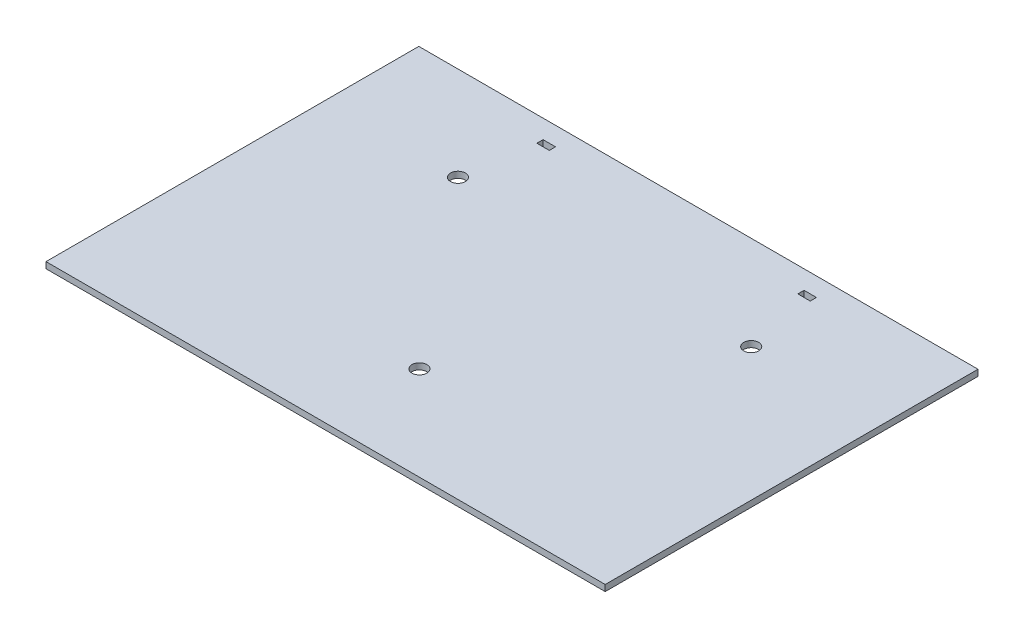
ISO-10303-21;
HEADER;
FILE_DESCRIPTION(('STEP AP214'),'2;1');
FILE_NAME('part.step','',(''),(''),'','','');
FILE_SCHEMA(('AUTOMOTIVE_DESIGN { 1 0 10303 214 1 1 1 1 }'));
ENDSEC;
DATA;
#1=APPLICATION_CONTEXT('core data for automotive mechanical design processes');
#2=APPLICATION_PROTOCOL_DEFINITION('international standard','automotive_design',2000,#1);
#3=PRODUCT_CONTEXT('',#1,'mechanical');
#4=PRODUCT('Part','Part','',(#3));
#5=PRODUCT_RELATED_PRODUCT_CATEGORY('part','',(#4));
#6=PRODUCT_DEFINITION_FORMATION('','',#4);
#7=PRODUCT_DEFINITION_CONTEXT('part definition',#1,'design');
#8=PRODUCT_DEFINITION('design','',#6,#7);
#9=PRODUCT_DEFINITION_SHAPE('','',#8);
#10=(LENGTH_UNIT() NAMED_UNIT(*) SI_UNIT(.MILLI.,.METRE.));
#11=(NAMED_UNIT(*) PLANE_ANGLE_UNIT() SI_UNIT($,.RADIAN.));
#12=(NAMED_UNIT(*) SI_UNIT($,.STERADIAN.) SOLID_ANGLE_UNIT());
#13=UNCERTAINTY_MEASURE_WITH_UNIT(LENGTH_MEASURE(1.E-05),#10,'distance_accuracy_value','');
#14=(GEOMETRIC_REPRESENTATION_CONTEXT(3) GLOBAL_UNCERTAINTY_ASSIGNED_CONTEXT((#13)) GLOBAL_UNIT_ASSIGNED_CONTEXT((#10,
#11,#12)) REPRESENTATION_CONTEXT('',''));
#15=CARTESIAN_POINT('',(0.,0.,0.));
#16=DIRECTION('',(0.,0.,1.));
#17=DIRECTION('',(1.,0.,0.));
#18=AXIS2_PLACEMENT_3D('',#15,#16,#17);
#19=CARTESIAN_POINT('',(225.,-5.,150.));
#20=DIRECTION('',(1.,0.,0.));
#21=DIRECTION('',(0.,0.,-1.));
#22=AXIS2_PLACEMENT_3D('',#19,#20,#21);
#23=PLANE('',#22);
#24=DIRECTION('',(0.,0.,-1.));
#25=VECTOR('',#24,1.);
#26=CARTESIAN_POINT('',(225.,0.,150.));
#27=LINE('',#26,#25);
#28=CARTESIAN_POINT('',(225.,0.,150.));
#29=VERTEX_POINT('',#28);
#30=CARTESIAN_POINT('',(225.,0.,-150.));
#31=VERTEX_POINT('',#30);
#32=EDGE_CURVE('E202',#29,#31,#27,.T.);
#33=ORIENTED_EDGE('',*,*,#32,.F.);
#34=DIRECTION('',(0.,1.,0.));
#35=VECTOR('',#34,1.);
#36=CARTESIAN_POINT('',(225.,-5.,150.));
#37=LINE('',#36,#35);
#38=CARTESIAN_POINT('',(225.,-5.,150.));
#39=VERTEX_POINT('',#38);
#40=EDGE_CURVE('E11',#39,#29,#37,.T.);
#41=ORIENTED_EDGE('',*,*,#40,.F.);
#42=DIRECTION('',(0.,0.,-1.));
#43=VECTOR('',#42,1.);
#44=CARTESIAN_POINT('',(225.,-5.,150.));
#45=LINE('',#44,#43);
#46=CARTESIAN_POINT('',(225.,-5.,-150.));
#47=VERTEX_POINT('',#46);
#48=EDGE_CURVE('E205',#39,#47,#45,.T.);
#49=ORIENTED_EDGE('',*,*,#48,.T.);
#50=DIRECTION('',(0.,1.,0.));
#51=VECTOR('',#50,1.);
#52=CARTESIAN_POINT('',(225.,-5.,-150.));
#53=LINE('',#52,#51);
#54=EDGE_CURVE('E34',#47,#31,#53,.T.);
#55=ORIENTED_EDGE('',*,*,#54,.T.);
#56=EDGE_LOOP('',(#33,#41,#49,#55));
#57=FACE_BOUND('',#56,.T.);
#58=ADVANCED_FACE('F31',(#57),#23,.T.);
#59=CARTESIAN_POINT('',(-225.,-5.,150.));
#60=DIRECTION('',(0.,0.,1.));
#61=DIRECTION('',(1.,0.,0.));
#62=AXIS2_PLACEMENT_3D('',#59,#60,#61);
#63=PLANE('',#62);
#64=DIRECTION('',(1.,0.,0.));
#65=VECTOR('',#64,1.);
#66=CARTESIAN_POINT('',(-225.,0.,150.));
#67=LINE('',#66,#65);
#68=CARTESIAN_POINT('',(-225.,0.,150.));
#69=VERTEX_POINT('',#68);
#70=EDGE_CURVE('E209',#69,#29,#67,.T.);
#71=ORIENTED_EDGE('',*,*,#70,.F.);
#72=DIRECTION('',(0.,1.,0.));
#73=VECTOR('',#72,1.);
#74=CARTESIAN_POINT('',(-225.,-5.,150.));
#75=LINE('',#74,#73);
#76=CARTESIAN_POINT('',(-225.,-5.,150.));
#77=VERTEX_POINT('',#76);
#78=EDGE_CURVE('E39',#77,#69,#75,.T.);
#79=ORIENTED_EDGE('',*,*,#78,.F.);
#80=DIRECTION('',(1.,0.,0.));
#81=VECTOR('',#80,1.);
#82=CARTESIAN_POINT('',(-225.,-5.,150.));
#83=LINE('',#82,#81);
#84=EDGE_CURVE('E215',#77,#39,#83,.T.);
#85=ORIENTED_EDGE('',*,*,#84,.T.);
#86=ORIENTED_EDGE('',*,*,#40,.T.);
#87=EDGE_LOOP('',(#71,#79,#85,#86));
#88=FACE_BOUND('',#87,.T.);
#89=ADVANCED_FACE('F241',(#88),#63,.T.);
#90=CARTESIAN_POINT('',(-225.,-5.,150.));
#91=DIRECTION('',(-1.,0.,0.));
#92=DIRECTION('',(0.,0.,1.));
#93=AXIS2_PLACEMENT_3D('',#90,#91,#92);
#94=PLANE('',#93);
#95=DIRECTION('',(0.,0.,1.));
#96=VECTOR('',#95,1.);
#97=CARTESIAN_POINT('',(-225.,0.,150.));
#98=LINE('',#97,#96);
#99=CARTESIAN_POINT('',(-225.,0.,-150.));
#100=VERTEX_POINT('',#99);
#101=EDGE_CURVE('E223',#100,#69,#98,.T.);
#102=ORIENTED_EDGE('',*,*,#101,.F.);
#103=DIRECTION('',(0.,1.,0.));
#104=VECTOR('',#103,1.);
#105=CARTESIAN_POINT('',(-225.,-5.,-150.));
#106=LINE('',#105,#104);
#107=CARTESIAN_POINT('',(-225.,-5.,-150.));
#108=VERTEX_POINT('',#107);
#109=EDGE_CURVE('E228',#108,#100,#106,.T.);
#110=ORIENTED_EDGE('',*,*,#109,.F.);
#111=DIRECTION('',(0.,0.,1.));
#112=VECTOR('',#111,1.);
#113=CARTESIAN_POINT('',(-225.,-5.,150.));
#114=LINE('',#113,#112);
#115=EDGE_CURVE('E212',#108,#77,#114,.T.);
#116=ORIENTED_EDGE('',*,*,#115,.T.);
#117=ORIENTED_EDGE('',*,*,#78,.T.);
#118=EDGE_LOOP('',(#102,#110,#116,#117));
#119=FACE_BOUND('',#118,.T.);
#120=ADVANCED_FACE('F246',(#119),#94,.T.);
#121=CARTESIAN_POINT('',(-225.,-5.,-150.));
#122=DIRECTION('',(0.,0.,-1.));
#123=DIRECTION('',(-1.,0.,0.));
#124=AXIS2_PLACEMENT_3D('',#121,#122,#123);
#125=PLANE('',#124);
#126=DIRECTION('',(-1.,0.,0.));
#127=VECTOR('',#126,1.);
#128=CARTESIAN_POINT('',(-225.,0.,-150.));
#129=LINE('',#128,#127);
#130=EDGE_CURVE('E220',#31,#100,#129,.T.);
#131=ORIENTED_EDGE('',*,*,#130,.F.);
#132=ORIENTED_EDGE('',*,*,#54,.F.);
#133=DIRECTION('',(-1.,0.,0.));
#134=VECTOR('',#133,1.);
#135=CARTESIAN_POINT('',(-225.,-5.,-150.));
#136=LINE('',#135,#134);
#137=EDGE_CURVE('E208',#47,#108,#136,.T.);
#138=ORIENTED_EDGE('',*,*,#137,.T.);
#139=ORIENTED_EDGE('',*,*,#109,.T.);
#140=EDGE_LOOP('',(#131,#132,#138,#139));
#141=FACE_BOUND('',#140,.T.);
#142=ADVANCED_FACE('F236',(#141),#125,.T.);
#143=CARTESIAN_POINT('',(225.,-5.,-150.));
#144=DIRECTION('',(0.,-1.,0.));
#145=DIRECTION('',(0.,0.,-1.));
#146=AXIS2_PLACEMENT_3D('',#143,#144,#145);
#147=PLANE('',#146);
#148=DIRECTION('',(0.,0.,1.));
#149=VECTOR('',#148,1.);
#150=CARTESIAN_POINT('',(100.,-5.,-135.));
#151=LINE('',#150,#149);
#152=CARTESIAN_POINT('',(100.,-5.,-135.));
#153=VERTEX_POINT('',#152);
#154=CARTESIAN_POINT('',(100.,-5.,-130.));
#155=VERTEX_POINT('',#154);
#156=EDGE_CURVE('E130',#153,#155,#151,.T.);
#157=ORIENTED_EDGE('',*,*,#156,.T.);
#158=DIRECTION('',(1.,0.,0.));
#159=VECTOR('',#158,1.);
#160=CARTESIAN_POINT('',(100.,-5.,-130.));
#161=LINE('',#160,#159);
#162=CARTESIAN_POINT('',(110.,-5.,-130.));
#163=VERTEX_POINT('',#162);
#164=EDGE_CURVE('E119',#155,#163,#161,.T.);
#165=ORIENTED_EDGE('',*,*,#164,.T.);
#166=DIRECTION('',(0.,0.,-1.));
#167=VECTOR('',#166,1.);
#168=CARTESIAN_POINT('',(110.,-5.,-135.));
#169=LINE('',#168,#167);
#170=CARTESIAN_POINT('',(110.,-5.,-135.));
#171=VERTEX_POINT('',#170);
#172=EDGE_CURVE('E141',#163,#171,#169,.T.);
#173=ORIENTED_EDGE('',*,*,#172,.T.);
#174=DIRECTION('',(-1.,0.,0.));
#175=VECTOR('',#174,1.);
#176=CARTESIAN_POINT('',(100.,-5.,-135.));
#177=LINE('',#176,#175);
#178=EDGE_CURVE('E137',#171,#153,#177,.T.);
#179=ORIENTED_EDGE('',*,*,#178,.T.);
#180=EDGE_LOOP('',(#157,#165,#173,#179));
#181=FACE_BOUND('',#180,.T.);
#182=DIRECTION('',(0.,0.,1.));
#183=VECTOR('',#182,1.);
#184=CARTESIAN_POINT('',(-110.,-5.,-135.));
#185=LINE('',#184,#183);
#186=CARTESIAN_POINT('',(-110.,-5.,-135.));
#187=VERTEX_POINT('',#186);
#188=CARTESIAN_POINT('',(-110.,-5.,-130.));
#189=VERTEX_POINT('',#188);
#190=EDGE_CURVE('E160',#187,#189,#185,.T.);
#191=ORIENTED_EDGE('',*,*,#190,.T.);
#192=DIRECTION('',(1.,0.,0.));
#193=VECTOR('',#192,1.);
#194=CARTESIAN_POINT('',(-110.,-5.,-130.));
#195=LINE('',#194,#193);
#196=CARTESIAN_POINT('',(-100.,-5.,-130.));
#197=VERTEX_POINT('',#196);
#198=EDGE_CURVE('E177',#189,#197,#195,.T.);
#199=ORIENTED_EDGE('',*,*,#198,.T.);
#200=DIRECTION('',(0.,0.,-1.));
#201=VECTOR('',#200,1.);
#202=CARTESIAN_POINT('',(-100.,-5.,-135.));
#203=LINE('',#202,#201);
#204=CARTESIAN_POINT('',(-100.,-5.,-135.));
#205=VERTEX_POINT('',#204);
#206=EDGE_CURVE('E126',#197,#205,#203,.T.);
#207=ORIENTED_EDGE('',*,*,#206,.T.);
#208=DIRECTION('',(-1.,0.,0.));
#209=VECTOR('',#208,1.);
#210=CARTESIAN_POINT('',(-110.,-5.,-135.));
#211=LINE('',#210,#209);
#212=EDGE_CURVE('E157',#205,#187,#211,.T.);
#213=ORIENTED_EDGE('',*,*,#212,.T.);
#214=EDGE_LOOP('',(#191,#199,#207,#213));
#215=FACE_BOUND('',#214,.T.);
#216=CARTESIAN_POINT('',(-118.,-5.,-74.5));
#217=DIRECTION('',(0.,-1.,0.));
#218=DIRECTION('',(0.,0.,-1.));
#219=AXIS2_PLACEMENT_3D('',#216,#217,#218);
#220=CIRCLE('',#219,6.00000000000002);
#221=CARTESIAN_POINT('',(-118.,-5.,-80.5));
#222=VERTEX_POINT('',#221);
#223=EDGE_CURVE('E186',#222,#222,#220,.F.);
#224=ORIENTED_EDGE('',*,*,#223,.T.);
#225=EDGE_LOOP('',(#224));
#226=FACE_BOUND('',#225,.T.);
#227=CARTESIAN_POINT('',(118.,-5.,-74.5));
#228=DIRECTION('',(0.,-1.,0.));
#229=DIRECTION('',(0.,0.,-1.));
#230=AXIS2_PLACEMENT_3D('',#227,#228,#229);
#231=CIRCLE('',#230,6.00000000000002);
#232=CARTESIAN_POINT('',(118.,-5.,-80.5));
#233=VERTEX_POINT('',#232);
#234=EDGE_CURVE('E190',#233,#233,#231,.F.);
#235=ORIENTED_EDGE('',*,*,#234,.T.);
#236=EDGE_LOOP('',(#235));
#237=FACE_BOUND('',#236,.T.);
#238=CARTESIAN_POINT('',(0.,-5.,74.5));
#239=DIRECTION('',(0.,-1.,0.));
#240=DIRECTION('',(0.,0.,-1.));
#241=AXIS2_PLACEMENT_3D('',#238,#239,#240);
#242=CIRCLE('',#241,6.00000000000001);
#243=CARTESIAN_POINT('',(0.,-5.,68.5));
#244=VERTEX_POINT('',#243);
#245=EDGE_CURVE('E196',#244,#244,#242,.F.);
#246=ORIENTED_EDGE('',*,*,#245,.T.);
#247=EDGE_LOOP('',(#246));
#248=FACE_BOUND('',#247,.T.);
#249=ORIENTED_EDGE('',*,*,#48,.F.);
#250=ORIENTED_EDGE('',*,*,#84,.F.);
#251=ORIENTED_EDGE('',*,*,#115,.F.);
#252=ORIENTED_EDGE('',*,*,#137,.F.);
#253=EDGE_LOOP('',(#249,#250,#251,#252));
#254=FACE_BOUND('',#253,.T.);
#255=ADVANCED_FACE('F135',(#181,#215,#226,#237,#248,#254),#147,.T.);
#256=CARTESIAN_POINT('',(225.,0.,-150.));
#257=DIRECTION('',(0.,-1.,0.));
#258=DIRECTION('',(0.,0.,-1.));
#259=AXIS2_PLACEMENT_3D('',#256,#257,#258);
#260=PLANE('',#259);
#261=DIRECTION('',(1.,0.,0.));
#262=VECTOR('',#261,1.);
#263=CARTESIAN_POINT('',(100.,0.,-130.));
#264=LINE('',#263,#262);
#265=CARTESIAN_POINT('',(100.,0.,-130.));
#266=VERTEX_POINT('',#265);
#267=CARTESIAN_POINT('',(110.,0.,-130.));
#268=VERTEX_POINT('',#267);
#269=EDGE_CURVE('E139',#266,#268,#264,.T.);
#270=ORIENTED_EDGE('',*,*,#269,.F.);
#271=DIRECTION('',(0.,0.,1.));
#272=VECTOR('',#271,1.);
#273=CARTESIAN_POINT('',(100.,0.,-135.));
#274=LINE('',#273,#272);
#275=CARTESIAN_POINT('',(100.,0.,-135.));
#276=VERTEX_POINT('',#275);
#277=EDGE_CURVE('E55',#276,#266,#274,.T.);
#278=ORIENTED_EDGE('',*,*,#277,.F.);
#279=DIRECTION('',(-1.,0.,0.));
#280=VECTOR('',#279,1.);
#281=CARTESIAN_POINT('',(100.,0.,-135.));
#282=LINE('',#281,#280);
#283=CARTESIAN_POINT('',(110.,0.,-135.));
#284=VERTEX_POINT('',#283);
#285=EDGE_CURVE('E132',#284,#276,#282,.T.);
#286=ORIENTED_EDGE('',*,*,#285,.F.);
#287=DIRECTION('',(0.,0.,-1.));
#288=VECTOR('',#287,1.);
#289=CARTESIAN_POINT('',(110.,0.,-135.));
#290=LINE('',#289,#288);
#291=EDGE_CURVE('E146',#268,#284,#290,.T.);
#292=ORIENTED_EDGE('',*,*,#291,.F.);
#293=EDGE_LOOP('',(#270,#278,#286,#292));
#294=FACE_BOUND('',#293,.T.);
#295=DIRECTION('',(1.,0.,0.));
#296=VECTOR('',#295,1.);
#297=CARTESIAN_POINT('',(-110.,0.,-130.));
#298=LINE('',#297,#296);
#299=CARTESIAN_POINT('',(-110.,0.,-130.));
#300=VERTEX_POINT('',#299);
#301=CARTESIAN_POINT('',(-100.,0.,-130.));
#302=VERTEX_POINT('',#301);
#303=EDGE_CURVE('E165',#300,#302,#298,.T.);
#304=ORIENTED_EDGE('',*,*,#303,.F.);
#305=DIRECTION('',(0.,0.,1.));
#306=VECTOR('',#305,1.);
#307=CARTESIAN_POINT('',(-110.,0.,-135.));
#308=LINE('',#307,#306);
#309=CARTESIAN_POINT('',(-110.,0.,-135.));
#310=VERTEX_POINT('',#309);
#311=EDGE_CURVE('E163',#310,#300,#308,.T.);
#312=ORIENTED_EDGE('',*,*,#311,.F.);
#313=DIRECTION('',(-1.,0.,0.));
#314=VECTOR('',#313,1.);
#315=CARTESIAN_POINT('',(-110.,0.,-135.));
#316=LINE('',#315,#314);
#317=CARTESIAN_POINT('',(-100.,0.,-135.));
#318=VERTEX_POINT('',#317);
#319=EDGE_CURVE('E171',#318,#310,#316,.T.);
#320=ORIENTED_EDGE('',*,*,#319,.F.);
#321=DIRECTION('',(0.,0.,-1.));
#322=VECTOR('',#321,1.);
#323=CARTESIAN_POINT('',(-100.,0.,-135.));
#324=LINE('',#323,#322);
#325=EDGE_CURVE('E168',#302,#318,#324,.T.);
#326=ORIENTED_EDGE('',*,*,#325,.F.);
#327=EDGE_LOOP('',(#304,#312,#320,#326));
#328=FACE_BOUND('',#327,.T.);
#329=CARTESIAN_POINT('',(-118.,0.,-74.5));
#330=DIRECTION('',(0.,1.,0.));
#331=DIRECTION('',(0.,0.,1.));
#332=AXIS2_PLACEMENT_3D('',#329,#330,#331);
#333=CIRCLE('',#332,6.00000000000002);
#334=CARTESIAN_POINT('',(-118.,0.,-68.5));
#335=VERTEX_POINT('',#334);
#336=EDGE_CURVE('E187',#335,#335,#333,.T.);
#337=ORIENTED_EDGE('',*,*,#336,.F.);
#338=EDGE_LOOP('',(#337));
#339=FACE_BOUND('',#338,.T.);
#340=CARTESIAN_POINT('',(118.,0.,-74.5));
#341=DIRECTION('',(0.,1.,0.));
#342=DIRECTION('',(0.,0.,1.));
#343=AXIS2_PLACEMENT_3D('',#340,#341,#342);
#344=CIRCLE('',#343,6.00000000000002);
#345=CARTESIAN_POINT('',(118.,0.,-68.5));
#346=VERTEX_POINT('',#345);
#347=EDGE_CURVE('E193',#346,#346,#344,.T.);
#348=ORIENTED_EDGE('',*,*,#347,.F.);
#349=EDGE_LOOP('',(#348));
#350=FACE_BOUND('',#349,.T.);
#351=CARTESIAN_POINT('',(0.,0.,74.5));
#352=DIRECTION('',(0.,1.,0.));
#353=DIRECTION('',(0.,0.,1.));
#354=AXIS2_PLACEMENT_3D('',#351,#352,#353);
#355=CIRCLE('',#354,6.00000000000001);
#356=CARTESIAN_POINT('',(0.,0.,80.5));
#357=VERTEX_POINT('',#356);
#358=EDGE_CURVE('E199',#357,#357,#355,.T.);
#359=ORIENTED_EDGE('',*,*,#358,.F.);
#360=EDGE_LOOP('',(#359));
#361=FACE_BOUND('',#360,.T.);
#362=ORIENTED_EDGE('',*,*,#32,.T.);
#363=ORIENTED_EDGE('',*,*,#130,.T.);
#364=ORIENTED_EDGE('',*,*,#101,.T.);
#365=ORIENTED_EDGE('',*,*,#70,.T.);
#366=EDGE_LOOP('',(#362,#363,#364,#365));
#367=FACE_BOUND('',#366,.T.);
#368=ADVANCED_FACE('F238',(#294,#328,#339,#350,#361,#367),#260,.F.);
#369=CARTESIAN_POINT('',(0.,-5.001,74.5));
#370=DIRECTION('',(0.,1.,0.));
#371=DIRECTION('',(0.,0.,1.));
#372=AXIS2_PLACEMENT_3D('',#369,#370,#371);
#373=CYLINDRICAL_SURFACE('',#372,6.00000000000001);
#374=ORIENTED_EDGE('',*,*,#245,.F.);
#375=EDGE_LOOP('',(#374));
#376=FACE_BOUND('',#375,.T.);
#377=ORIENTED_EDGE('',*,*,#358,.T.);
#378=EDGE_LOOP('',(#377));
#379=FACE_BOUND('',#378,.T.);
#380=ADVANCED_FACE('F278',(#376,#379),#373,.F.);
#381=CARTESIAN_POINT('',(118.,-5.001,-74.5));
#382=DIRECTION('',(0.,1.,0.));
#383=DIRECTION('',(0.,0.,1.));
#384=AXIS2_PLACEMENT_3D('',#381,#382,#383);
#385=CYLINDRICAL_SURFACE('',#384,6.00000000000002);
#386=ORIENTED_EDGE('',*,*,#234,.F.);
#387=EDGE_LOOP('',(#386));
#388=FACE_BOUND('',#387,.T.);
#389=ORIENTED_EDGE('',*,*,#347,.T.);
#390=EDGE_LOOP('',(#389));
#391=FACE_BOUND('',#390,.T.);
#392=ADVANCED_FACE('F283',(#388,#391),#385,.F.);
#393=CARTESIAN_POINT('',(-118.,-5.001,-74.5));
#394=DIRECTION('',(0.,1.,0.));
#395=DIRECTION('',(0.,0.,1.));
#396=AXIS2_PLACEMENT_3D('',#393,#394,#395);
#397=CYLINDRICAL_SURFACE('',#396,6.00000000000002);
#398=ORIENTED_EDGE('',*,*,#223,.F.);
#399=EDGE_LOOP('',(#398));
#400=FACE_BOUND('',#399,.T.);
#401=ORIENTED_EDGE('',*,*,#336,.T.);
#402=EDGE_LOOP('',(#401));
#403=FACE_BOUND('',#402,.T.);
#404=ADVANCED_FACE('F295',(#400,#403),#397,.F.);
#405=CARTESIAN_POINT('',(-110.,-5.001,-135.));
#406=DIRECTION('',(-1.,0.,0.));
#407=DIRECTION('',(0.,0.,1.));
#408=AXIS2_PLACEMENT_3D('',#405,#406,#407);
#409=PLANE('',#408);
#410=DIRECTION('',(0.,1.,0.));
#411=VECTOR('',#410,1.);
#412=CARTESIAN_POINT('',(-110.,-5.001,-135.));
#413=LINE('',#412,#411);
#414=EDGE_CURVE('E175',#187,#310,#413,.T.);
#415=ORIENTED_EDGE('',*,*,#414,.T.);
#416=ORIENTED_EDGE('',*,*,#311,.T.);
#417=DIRECTION('',(0.,1.,0.));
#418=VECTOR('',#417,1.);
#419=CARTESIAN_POINT('',(-110.,-5.001,-130.));
#420=LINE('',#419,#418);
#421=EDGE_CURVE('E174',#189,#300,#420,.T.);
#422=ORIENTED_EDGE('',*,*,#421,.F.);
#423=ORIENTED_EDGE('',*,*,#190,.F.);
#424=EDGE_LOOP('',(#415,#416,#422,#423));
#425=FACE_BOUND('',#424,.T.);
#426=ADVANCED_FACE('F305',(#425),#409,.F.);
#427=CARTESIAN_POINT('',(-110.,-5.001,-135.));
#428=DIRECTION('',(0.,0.,-1.));
#429=DIRECTION('',(-1.,0.,0.));
#430=AXIS2_PLACEMENT_3D('',#427,#428,#429);
#431=PLANE('',#430);
#432=DIRECTION('',(0.,1.,0.));
#433=VECTOR('',#432,1.);
#434=CARTESIAN_POINT('',(-100.,-5.001,-135.));
#435=LINE('',#434,#433);
#436=EDGE_CURVE('E178',#205,#318,#435,.T.);
#437=ORIENTED_EDGE('',*,*,#436,.T.);
#438=ORIENTED_EDGE('',*,*,#319,.T.);
#439=ORIENTED_EDGE('',*,*,#414,.F.);
#440=ORIENTED_EDGE('',*,*,#212,.F.);
#441=EDGE_LOOP('',(#437,#438,#439,#440));
#442=FACE_BOUND('',#441,.T.);
#443=ADVANCED_FACE('F328',(#442),#431,.F.);
#444=CARTESIAN_POINT('',(-100.,-5.001,-135.));
#445=DIRECTION('',(1.,0.,0.));
#446=DIRECTION('',(0.,0.,-1.));
#447=AXIS2_PLACEMENT_3D('',#444,#445,#446);
#448=PLANE('',#447);
#449=DIRECTION('',(0.,1.,0.));
#450=VECTOR('',#449,1.);
#451=CARTESIAN_POINT('',(-100.,-5.001,-130.));
#452=LINE('',#451,#450);
#453=EDGE_CURVE('E180',#197,#302,#452,.T.);
#454=ORIENTED_EDGE('',*,*,#453,.T.);
#455=ORIENTED_EDGE('',*,*,#325,.T.);
#456=ORIENTED_EDGE('',*,*,#436,.F.);
#457=ORIENTED_EDGE('',*,*,#206,.F.);
#458=EDGE_LOOP('',(#454,#455,#456,#457));
#459=FACE_BOUND('',#458,.T.);
#460=ADVANCED_FACE('F338',(#459),#448,.F.);
#461=CARTESIAN_POINT('',(-110.,-5.001,-130.));
#462=DIRECTION('',(0.,0.,1.));
#463=DIRECTION('',(1.,0.,0.));
#464=AXIS2_PLACEMENT_3D('',#461,#462,#463);
#465=PLANE('',#464);
#466=ORIENTED_EDGE('',*,*,#421,.T.);
#467=ORIENTED_EDGE('',*,*,#303,.T.);
#468=ORIENTED_EDGE('',*,*,#453,.F.);
#469=ORIENTED_EDGE('',*,*,#198,.F.);
#470=EDGE_LOOP('',(#466,#467,#468,#469));
#471=FACE_BOUND('',#470,.T.);
#472=ADVANCED_FACE('F348',(#471),#465,.F.);
#473=CARTESIAN_POINT('',(100.,-5.001,-135.));
#474=DIRECTION('',(-1.,0.,0.));
#475=DIRECTION('',(0.,0.,1.));
#476=AXIS2_PLACEMENT_3D('',#473,#474,#475);
#477=PLANE('',#476);
#478=DIRECTION('',(0.,1.,0.));
#479=VECTOR('',#478,1.);
#480=CARTESIAN_POINT('',(100.,-5.001,-135.));
#481=LINE('',#480,#479);
#482=EDGE_CURVE('E127',#153,#276,#481,.T.);
#483=ORIENTED_EDGE('',*,*,#482,.T.);
#484=ORIENTED_EDGE('',*,*,#277,.T.);
#485=DIRECTION('',(0.,1.,0.));
#486=VECTOR('',#485,1.);
#487=CARTESIAN_POINT('',(100.,-5.001,-130.));
#488=LINE('',#487,#486);
#489=EDGE_CURVE('E121',#155,#266,#488,.T.);
#490=ORIENTED_EDGE('',*,*,#489,.F.);
#491=ORIENTED_EDGE('',*,*,#156,.F.);
#492=EDGE_LOOP('',(#483,#484,#490,#491));
#493=FACE_BOUND('',#492,.T.);
#494=ADVANCED_FACE('F129',(#493),#477,.F.);
#495=CARTESIAN_POINT('',(100.,-5.001,-135.));
#496=DIRECTION('',(0.,0.,-1.));
#497=DIRECTION('',(-1.,0.,0.));
#498=AXIS2_PLACEMENT_3D('',#495,#496,#497);
#499=PLANE('',#498);
#500=DIRECTION('',(0.,1.,0.));
#501=VECTOR('',#500,1.);
#502=CARTESIAN_POINT('',(110.,-5.001,-135.));
#503=LINE('',#502,#501);
#504=EDGE_CURVE('E152',#171,#284,#503,.T.);
#505=ORIENTED_EDGE('',*,*,#504,.T.);
#506=ORIENTED_EDGE('',*,*,#285,.T.);
#507=ORIENTED_EDGE('',*,*,#482,.F.);
#508=ORIENTED_EDGE('',*,*,#178,.F.);
#509=EDGE_LOOP('',(#505,#506,#507,#508));
#510=FACE_BOUND('',#509,.T.);
#511=ADVANCED_FACE('F367',(#510),#499,.F.);
#512=CARTESIAN_POINT('',(110.,-5.001,-135.));
#513=DIRECTION('',(1.,0.,0.));
#514=DIRECTION('',(0.,0.,-1.));
#515=AXIS2_PLACEMENT_3D('',#512,#513,#514);
#516=PLANE('',#515);
#517=DIRECTION('',(0.,1.,0.));
#518=VECTOR('',#517,1.);
#519=CARTESIAN_POINT('',(110.,-5.001,-130.));
#520=LINE('',#519,#518);
#521=EDGE_CURVE('E47',#163,#268,#520,.T.);
#522=ORIENTED_EDGE('',*,*,#521,.T.);
#523=ORIENTED_EDGE('',*,*,#291,.T.);
#524=ORIENTED_EDGE('',*,*,#504,.F.);
#525=ORIENTED_EDGE('',*,*,#172,.F.);
#526=EDGE_LOOP('',(#522,#523,#524,#525));
#527=FACE_BOUND('',#526,.T.);
#528=ADVANCED_FACE('F376',(#527),#516,.F.);
#529=CARTESIAN_POINT('',(100.,-5.001,-130.));
#530=DIRECTION('',(0.,0.,1.));
#531=DIRECTION('',(1.,0.,0.));
#532=AXIS2_PLACEMENT_3D('',#529,#530,#531);
#533=PLANE('',#532);
#534=ORIENTED_EDGE('',*,*,#489,.T.);
#535=ORIENTED_EDGE('',*,*,#269,.T.);
#536=ORIENTED_EDGE('',*,*,#521,.F.);
#537=ORIENTED_EDGE('',*,*,#164,.F.);
#538=EDGE_LOOP('',(#534,#535,#536,#537));
#539=FACE_BOUND('',#538,.T.);
#540=ADVANCED_FACE('F120',(#539),#533,.F.);
#541=CLOSED_SHELL('',(#58,#89,#120,#142,#255,#368,#380,#392,#404,#426,#443,#460,#472,#494,#511,
#528,#540));
#542=MANIFOLD_SOLID_BREP('B2',#541);
#543=ADVANCED_BREP_SHAPE_REPRESENTATION('',(#18,#542),#14);
#544=SHAPE_DEFINITION_REPRESENTATION(#9,#543);
ENDSEC;
END-ISO-10303-21;
